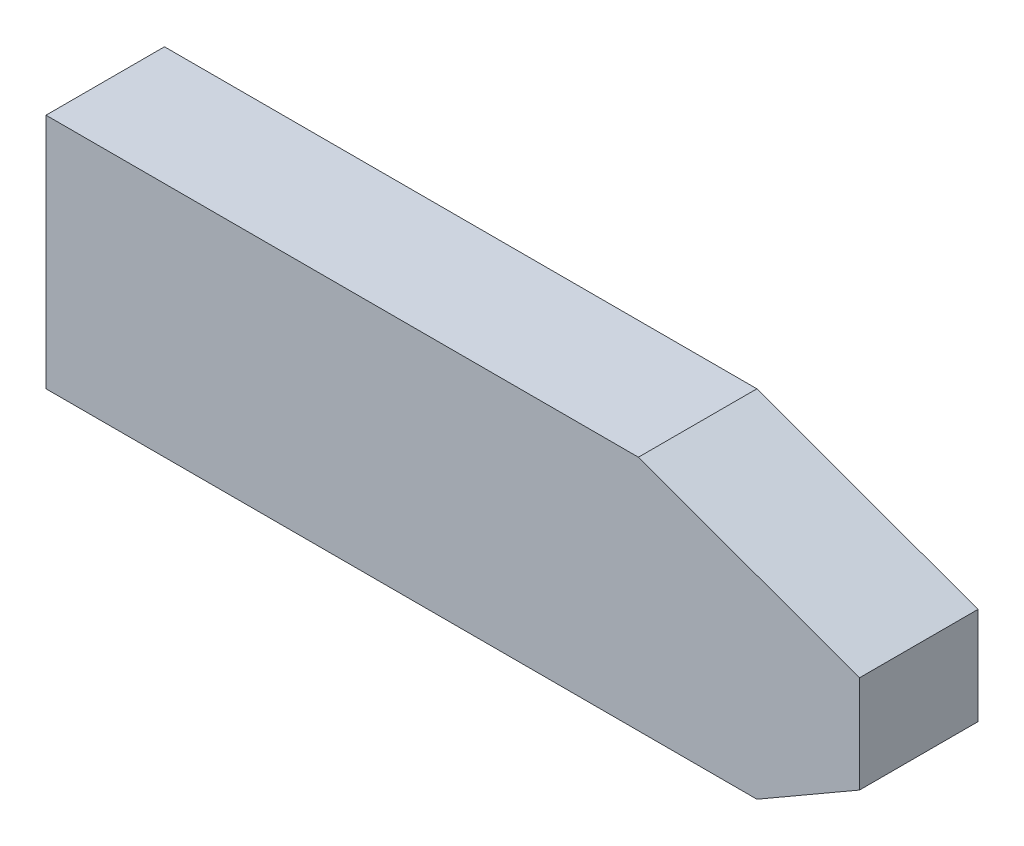
ISO-10303-21;
HEADER;
FILE_DESCRIPTION(('STEP AP214'),'2;1');
FILE_NAME('part.step','',(''),(''),'','','');
FILE_SCHEMA(('AUTOMOTIVE_DESIGN { 1 0 10303 214 1 1 1 1 }'));
ENDSEC;
DATA;
#1=APPLICATION_CONTEXT('core data for automotive mechanical design processes');
#2=APPLICATION_PROTOCOL_DEFINITION('international standard','automotive_design',2000,#1);
#3=PRODUCT_CONTEXT('',#1,'mechanical');
#4=PRODUCT('Part','Part','',(#3));
#5=PRODUCT_RELATED_PRODUCT_CATEGORY('part','',(#4));
#6=PRODUCT_DEFINITION_FORMATION('','',#4);
#7=PRODUCT_DEFINITION_CONTEXT('part definition',#1,'design');
#8=PRODUCT_DEFINITION('design','',#6,#7);
#9=PRODUCT_DEFINITION_SHAPE('','',#8);
#10=(LENGTH_UNIT() NAMED_UNIT(*) SI_UNIT(.MILLI.,.METRE.));
#11=(NAMED_UNIT(*) PLANE_ANGLE_UNIT() SI_UNIT($,.RADIAN.));
#12=(NAMED_UNIT(*) SI_UNIT($,.STERADIAN.) SOLID_ANGLE_UNIT());
#13=UNCERTAINTY_MEASURE_WITH_UNIT(LENGTH_MEASURE(1.E-05),#10,'distance_accuracy_value','');
#14=(GEOMETRIC_REPRESENTATION_CONTEXT(3) GLOBAL_UNCERTAINTY_ASSIGNED_CONTEXT((#13)) GLOBAL_UNIT_ASSIGNED_CONTEXT((#10,
#11,#12)) REPRESENTATION_CONTEXT('',''));
#15=CARTESIAN_POINT('',(0.,0.,0.));
#16=DIRECTION('',(0.,0.,1.));
#17=DIRECTION('',(1.,0.,0.));
#18=AXIS2_PLACEMENT_3D('',#15,#16,#17);
#19=CARTESIAN_POINT('',(152.4,0.,25.4));
#20=DIRECTION('',(0.,1.,0.));
#21=DIRECTION('',(-1.,0.,0.));
#22=AXIS2_PLACEMENT_3D('',#19,#20,#21);
#23=PLANE('',#22);
#24=DIRECTION('',(1.,0.,0.));
#25=VECTOR('',#24,1.);
#26=CARTESIAN_POINT('',(152.4,0.,0.));
#27=LINE('',#26,#25);
#28=CARTESIAN_POINT('',(0.,0.,0.));
#29=VERTEX_POINT('',#28);
#30=CARTESIAN_POINT('',(152.4,0.,0.));
#31=VERTEX_POINT('',#30);
#32=EDGE_CURVE('E128',#29,#31,#27,.T.);
#33=ORIENTED_EDGE('',*,*,#32,.T.);
#34=DIRECTION('',(0.,0.,-1.));
#35=VECTOR('',#34,1.);
#36=CARTESIAN_POINT('',(152.4,0.,25.4));
#37=LINE('',#36,#35);
#38=CARTESIAN_POINT('',(152.4,0.,25.4));
#39=VERTEX_POINT('',#38);
#40=EDGE_CURVE('E11',#39,#31,#37,.T.);
#41=ORIENTED_EDGE('',*,*,#40,.F.);
#42=DIRECTION('',(1.,0.,0.));
#43=VECTOR('',#42,1.);
#44=CARTESIAN_POINT('',(152.4,0.,25.4));
#45=LINE('',#44,#43);
#46=CARTESIAN_POINT('',(0.,0.,25.4));
#47=VERTEX_POINT('',#46);
#48=EDGE_CURVE('E144',#47,#39,#45,.T.);
#49=ORIENTED_EDGE('',*,*,#48,.F.);
#50=DIRECTION('',(0.,0.,-1.));
#51=VECTOR('',#50,1.);
#52=CARTESIAN_POINT('',(0.,0.,25.4));
#53=LINE('',#52,#51);
#54=EDGE_CURVE('E124',#47,#29,#53,.T.);
#55=ORIENTED_EDGE('',*,*,#54,.T.);
#56=EDGE_LOOP('',(#33,#41,#49,#55));
#57=FACE_BOUND('',#56,.T.);
#58=ADVANCED_FACE('F39',(#57),#23,.F.);
#59=CARTESIAN_POINT('',(174.397045256125,12.7,25.4));
#60=DIRECTION('',(-0.500000000000001,0.866025403784438,0.));
#61=DIRECTION('',(-0.866025403784438,-0.500000000000001,0.));
#62=AXIS2_PLACEMENT_3D('',#59,#60,#61);
#63=PLANE('',#62);
#64=DIRECTION('',(0.866025403784438,0.500000000000001,0.));
#65=VECTOR('',#64,1.);
#66=CARTESIAN_POINT('',(174.397045256125,12.7,0.));
#67=LINE('',#66,#65);
#68=CARTESIAN_POINT('',(174.397045256125,12.7,0.));
#69=VERTEX_POINT('',#68);
#70=EDGE_CURVE('E132',#31,#69,#67,.T.);
#71=ORIENTED_EDGE('',*,*,#70,.T.);
#72=DIRECTION('',(0.,0.,-1.));
#73=VECTOR('',#72,1.);
#74=CARTESIAN_POINT('',(174.397045256125,12.7,25.4));
#75=LINE('',#74,#73);
#76=CARTESIAN_POINT('',(174.397045256125,12.7,25.4));
#77=VERTEX_POINT('',#76);
#78=EDGE_CURVE('E48',#77,#69,#75,.T.);
#79=ORIENTED_EDGE('',*,*,#78,.F.);
#80=DIRECTION('',(0.866025403784438,0.500000000000001,0.));
#81=VECTOR('',#80,1.);
#82=CARTESIAN_POINT('',(174.397045256125,12.7,25.4));
#83=LINE('',#82,#81);
#84=EDGE_CURVE('E93',#39,#77,#83,.T.);
#85=ORIENTED_EDGE('',*,*,#84,.F.);
#86=ORIENTED_EDGE('',*,*,#40,.T.);
#87=EDGE_LOOP('',(#71,#79,#85,#86));
#88=FACE_BOUND('',#87,.T.);
#89=ADVANCED_FACE('F172',(#88),#63,.F.);
#90=CARTESIAN_POINT('',(174.397045256125,33.5488863346025,25.4));
#91=DIRECTION('',(-1.,0.,0.));
#92=DIRECTION('',(0.,0.,1.));
#93=AXIS2_PLACEMENT_3D('',#90,#91,#92);
#94=PLANE('',#93);
#95=DIRECTION('',(0.,1.,0.));
#96=VECTOR('',#95,1.);
#97=CARTESIAN_POINT('',(174.397045256125,33.5488863346025,0.));
#98=LINE('',#97,#96);
#99=CARTESIAN_POINT('',(174.397045256125,33.5488863346025,0.));
#100=VERTEX_POINT('',#99);
#101=EDGE_CURVE('E135',#69,#100,#98,.T.);
#102=ORIENTED_EDGE('',*,*,#101,.T.);
#103=DIRECTION('',(0.,0.,-1.));
#104=VECTOR('',#103,1.);
#105=CARTESIAN_POINT('',(174.397045256125,33.5488863346025,25.4));
#106=LINE('',#105,#104);
#107=CARTESIAN_POINT('',(174.397045256125,33.5488863346025,25.4));
#108=VERTEX_POINT('',#107);
#109=EDGE_CURVE('E117',#108,#100,#106,.T.);
#110=ORIENTED_EDGE('',*,*,#109,.F.);
#111=DIRECTION('',(0.,1.,0.));
#112=VECTOR('',#111,1.);
#113=CARTESIAN_POINT('',(174.397045256125,33.5488863346025,25.4));
#114=LINE('',#113,#112);
#115=EDGE_CURVE('E106',#77,#108,#114,.T.);
#116=ORIENTED_EDGE('',*,*,#115,.F.);
#117=ORIENTED_EDGE('',*,*,#78,.T.);
#118=EDGE_LOOP('',(#102,#110,#116,#117));
#119=FACE_BOUND('',#118,.T.);
#120=ADVANCED_FACE('F154',(#119),#94,.F.);
#121=CARTESIAN_POINT('',(127.,50.8,25.4));
#122=DIRECTION('',(-0.342020143325668,-0.939692620785909,0.));
#123=DIRECTION('',(0.939692620785909,-0.342020143325668,0.));
#124=AXIS2_PLACEMENT_3D('',#121,#122,#123);
#125=PLANE('',#124);
#126=DIRECTION('',(-0.939692620785909,0.342020143325668,0.));
#127=VECTOR('',#126,1.);
#128=CARTESIAN_POINT('',(127.,50.8,0.));
#129=LINE('',#128,#127);
#130=CARTESIAN_POINT('',(127.,50.8,0.));
#131=VERTEX_POINT('',#130);
#132=EDGE_CURVE('E115',#100,#131,#129,.T.);
#133=ORIENTED_EDGE('',*,*,#132,.T.);
#134=DIRECTION('',(0.,0.,-1.));
#135=VECTOR('',#134,1.);
#136=CARTESIAN_POINT('',(127.,50.8,25.4));
#137=LINE('',#136,#135);
#138=CARTESIAN_POINT('',(127.,50.8,25.4));
#139=VERTEX_POINT('',#138);
#140=EDGE_CURVE('E112',#139,#131,#137,.T.);
#141=ORIENTED_EDGE('',*,*,#140,.F.);
#142=DIRECTION('',(-0.939692620785909,0.342020143325668,0.));
#143=VECTOR('',#142,1.);
#144=CARTESIAN_POINT('',(127.,50.8,25.4));
#145=LINE('',#144,#143);
#146=EDGE_CURVE('E100',#108,#139,#145,.T.);
#147=ORIENTED_EDGE('',*,*,#146,.F.);
#148=ORIENTED_EDGE('',*,*,#109,.T.);
#149=EDGE_LOOP('',(#133,#141,#147,#148));
#150=FACE_BOUND('',#149,.T.);
#151=ADVANCED_FACE('F113',(#150),#125,.F.);
#152=CARTESIAN_POINT('',(0.,50.8,25.4));
#153=DIRECTION('',(0.,-1.,0.));
#154=DIRECTION('',(0.,0.,-1.));
#155=AXIS2_PLACEMENT_3D('',#152,#153,#154);
#156=PLANE('',#155);
#157=DIRECTION('',(-1.,0.,0.));
#158=VECTOR('',#157,1.);
#159=CARTESIAN_POINT('',(0.,50.8,0.));
#160=LINE('',#159,#158);
#161=CARTESIAN_POINT('',(0.,50.8,0.));
#162=VERTEX_POINT('',#161);
#163=EDGE_CURVE('E79',#131,#162,#160,.T.);
#164=ORIENTED_EDGE('',*,*,#163,.T.);
#165=DIRECTION('',(0.,0.,-1.));
#166=VECTOR('',#165,1.);
#167=CARTESIAN_POINT('',(0.,50.8,25.4));
#168=LINE('',#167,#166);
#169=CARTESIAN_POINT('',(0.,50.8,25.4));
#170=VERTEX_POINT('',#169);
#171=EDGE_CURVE('E118',#170,#162,#168,.T.);
#172=ORIENTED_EDGE('',*,*,#171,.F.);
#173=DIRECTION('',(-1.,0.,0.));
#174=VECTOR('',#173,1.);
#175=CARTESIAN_POINT('',(0.,50.8,25.4));
#176=LINE('',#175,#174);
#177=EDGE_CURVE('E104',#139,#170,#176,.T.);
#178=ORIENTED_EDGE('',*,*,#177,.F.);
#179=ORIENTED_EDGE('',*,*,#140,.T.);
#180=EDGE_LOOP('',(#164,#172,#178,#179));
#181=FACE_BOUND('',#180,.T.);
#182=ADVANCED_FACE('F120',(#181),#156,.F.);
#183=CARTESIAN_POINT('',(0.,0.,25.4));
#184=DIRECTION('',(1.,0.,0.));
#185=DIRECTION('',(0.,0.,-1.));
#186=AXIS2_PLACEMENT_3D('',#183,#184,#185);
#187=PLANE('',#186);
#188=DIRECTION('',(0.,-1.,0.));
#189=VECTOR('',#188,1.);
#190=CARTESIAN_POINT('',(0.,0.,0.));
#191=LINE('',#190,#189);
#192=EDGE_CURVE('E85',#162,#29,#191,.T.);
#193=ORIENTED_EDGE('',*,*,#192,.T.);
#194=ORIENTED_EDGE('',*,*,#54,.F.);
#195=DIRECTION('',(0.,-1.,0.));
#196=VECTOR('',#195,1.);
#197=CARTESIAN_POINT('',(0.,0.,25.4));
#198=LINE('',#197,#196);
#199=EDGE_CURVE('E56',#170,#47,#198,.T.);
#200=ORIENTED_EDGE('',*,*,#199,.F.);
#201=ORIENTED_EDGE('',*,*,#171,.T.);
#202=EDGE_LOOP('',(#193,#194,#200,#201));
#203=FACE_BOUND('',#202,.T.);
#204=ADVANCED_FACE('F161',(#203),#187,.F.);
#205=CARTESIAN_POINT('',(0.,0.,25.4));
#206=DIRECTION('',(0.,0.,-1.));
#207=DIRECTION('',(-1.,0.,0.));
#208=AXIS2_PLACEMENT_3D('',#205,#206,#207);
#209=PLANE('',#208);
#210=ORIENTED_EDGE('',*,*,#48,.T.);
#211=ORIENTED_EDGE('',*,*,#84,.T.);
#212=ORIENTED_EDGE('',*,*,#115,.T.);
#213=ORIENTED_EDGE('',*,*,#146,.T.);
#214=ORIENTED_EDGE('',*,*,#177,.T.);
#215=ORIENTED_EDGE('',*,*,#199,.T.);
#216=EDGE_LOOP('',(#210,#211,#212,#213,#214,#215));
#217=FACE_BOUND('',#216,.T.);
#218=ADVANCED_FACE('F102',(#217),#209,.F.);
#219=CARTESIAN_POINT('',(0.,0.,0.));
#220=DIRECTION('',(0.,0.,-1.));
#221=DIRECTION('',(-1.,0.,0.));
#222=AXIS2_PLACEMENT_3D('',#219,#220,#221);
#223=PLANE('',#222);
#224=ORIENTED_EDGE('',*,*,#32,.F.);
#225=ORIENTED_EDGE('',*,*,#192,.F.);
#226=ORIENTED_EDGE('',*,*,#163,.F.);
#227=ORIENTED_EDGE('',*,*,#132,.F.);
#228=ORIENTED_EDGE('',*,*,#101,.F.);
#229=ORIENTED_EDGE('',*,*,#70,.F.);
#230=EDGE_LOOP('',(#224,#225,#226,#227,#228,#229));
#231=FACE_BOUND('',#230,.T.);
#232=ADVANCED_FACE('F157',(#231),#223,.T.);
#233=CLOSED_SHELL('',(#58,#89,#120,#151,#182,#204,#218,#232));
#234=MANIFOLD_SOLID_BREP('B2',#233);
#235=ADVANCED_BREP_SHAPE_REPRESENTATION('',(#18,#234),#14);
#236=SHAPE_DEFINITION_REPRESENTATION(#9,#235);
ENDSEC;
END-ISO-10303-21;
